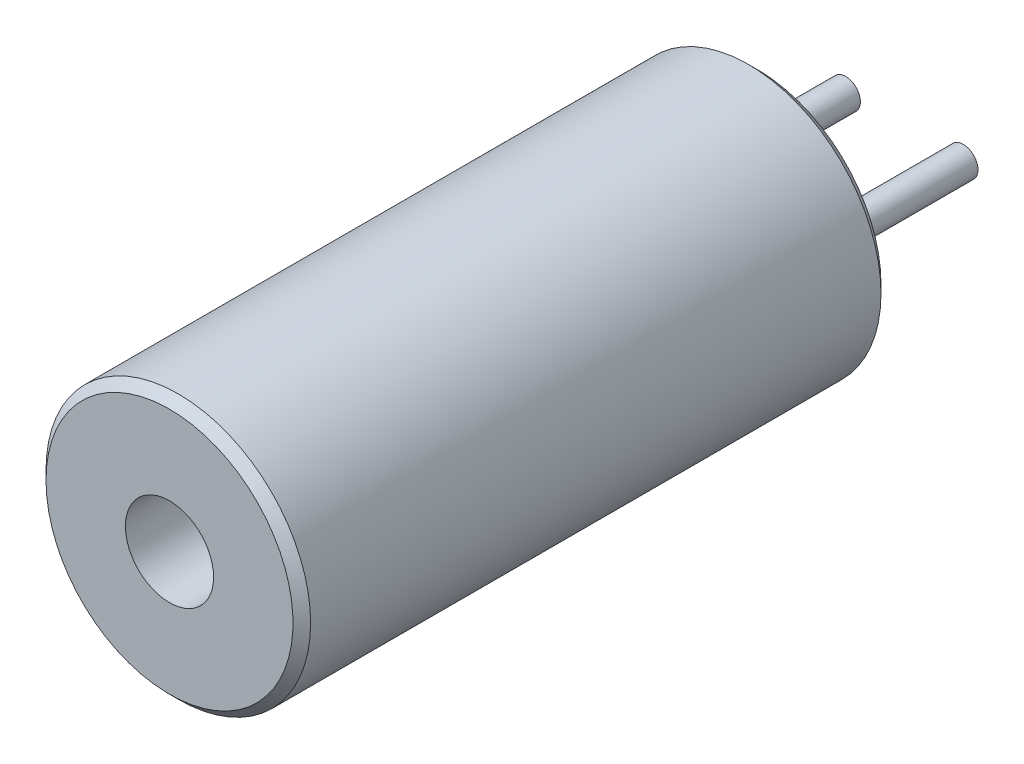
ISO-10303-21;
HEADER;
FILE_DESCRIPTION(('STEP AP214'),'2;1');
FILE_NAME('part.step','',(''),(''),'','','');
FILE_SCHEMA(('AUTOMOTIVE_DESIGN { 1 0 10303 214 1 1 1 1 }'));
ENDSEC;
DATA;
#1=APPLICATION_CONTEXT('core data for automotive mechanical design processes');
#2=APPLICATION_PROTOCOL_DEFINITION('international standard','automotive_design',2000,#1);
#3=PRODUCT_CONTEXT('',#1,'mechanical');
#4=PRODUCT('Part','Part','',(#3));
#5=PRODUCT_RELATED_PRODUCT_CATEGORY('part','',(#4));
#6=PRODUCT_DEFINITION_FORMATION('','',#4);
#7=PRODUCT_DEFINITION_CONTEXT('part definition',#1,'design');
#8=PRODUCT_DEFINITION('design','',#6,#7);
#9=PRODUCT_DEFINITION_SHAPE('','',#8);
#10=(LENGTH_UNIT() NAMED_UNIT(*) SI_UNIT(.MILLI.,.METRE.));
#11=(NAMED_UNIT(*) PLANE_ANGLE_UNIT() SI_UNIT($,.RADIAN.));
#12=(NAMED_UNIT(*) SI_UNIT($,.STERADIAN.) SOLID_ANGLE_UNIT());
#13=UNCERTAINTY_MEASURE_WITH_UNIT(LENGTH_MEASURE(1.E-05),#10,'distance_accuracy_value','');
#14=(GEOMETRIC_REPRESENTATION_CONTEXT(3) GLOBAL_UNCERTAINTY_ASSIGNED_CONTEXT((#13)) GLOBAL_UNIT_ASSIGNED_CONTEXT((#10,
#11,#12)) REPRESENTATION_CONTEXT('',''));
#15=CARTESIAN_POINT('',(0.,0.,0.));
#16=DIRECTION('',(0.,0.,1.));
#17=DIRECTION('',(1.,0.,0.));
#18=AXIS2_PLACEMENT_3D('',#15,#16,#17);
#19=CARTESIAN_POINT('',(0.,0.,10.));
#20=DIRECTION('',(0.,0.,-1.));
#21=DIRECTION('',(-1.,0.,0.));
#22=AXIS2_PLACEMENT_3D('',#19,#20,#21);
#23=PLANE('',#22);
#24=CARTESIAN_POINT('',(0.,0.,10.));
#25=DIRECTION('',(0.,0.,-1.));
#26=DIRECTION('',(-1.,0.,0.));
#27=AXIS2_PLACEMENT_3D('',#24,#25,#26);
#28=CIRCLE('',#27,4.2);
#29=CARTESIAN_POINT('',(-4.2,0.,10.));
#30=VERTEX_POINT('',#29);
#31=EDGE_CURVE('E50',#30,#30,#28,.F.);
#32=ORIENTED_EDGE('',*,*,#31,.T.);
#33=EDGE_LOOP('',(#32));
#34=FACE_BOUND('',#33,.T.);
#35=CARTESIAN_POINT('',(0.,0.,10.));
#36=DIRECTION('',(0.,0.,1.));
#37=DIRECTION('',(1.,0.,0.));
#38=AXIS2_PLACEMENT_3D('',#35,#36,#37);
#39=CIRCLE('',#38,1.5);
#40=CARTESIAN_POINT('',(1.5,0.,10.));
#41=VERTEX_POINT('',#40);
#42=EDGE_CURVE('E70',#41,#41,#39,.T.);
#43=ORIENTED_EDGE('',*,*,#42,.F.);
#44=EDGE_LOOP('',(#43));
#45=FACE_BOUND('',#44,.T.);
#46=ADVANCED_FACE('F37',(#34,#45),#23,.F.);
#47=CARTESIAN_POINT('',(0.,0.,10.));
#48=DIRECTION('',(0.,0.,1.));
#49=DIRECTION('',(1.,0.,0.));
#50=AXIS2_PLACEMENT_3D('',#47,#48,#49);
#51=CYLINDRICAL_SURFACE('',#50,4.5);
#52=CARTESIAN_POINT('',(0.,0.,-9.7));
#53=DIRECTION('',(0.,0.,1.));
#54=DIRECTION('',(1.,0.,0.));
#55=AXIS2_PLACEMENT_3D('',#52,#53,#54);
#56=CIRCLE('',#55,4.5);
#57=CARTESIAN_POINT('',(4.5,0.,-9.7));
#58=VERTEX_POINT('',#57);
#59=EDGE_CURVE('E61',#58,#58,#56,.T.);
#60=ORIENTED_EDGE('',*,*,#59,.T.);
#61=EDGE_LOOP('',(#60));
#62=FACE_BOUND('',#61,.T.);
#63=CARTESIAN_POINT('',(0.,0.,9.7));
#64=DIRECTION('',(0.,0.,-1.));
#65=DIRECTION('',(-1.,0.,0.));
#66=AXIS2_PLACEMENT_3D('',#63,#64,#65);
#67=CIRCLE('',#66,4.5);
#68=CARTESIAN_POINT('',(-4.5,0.,9.7));
#69=VERTEX_POINT('',#68);
#70=EDGE_CURVE('E65',#69,#69,#67,.T.);
#71=ORIENTED_EDGE('',*,*,#70,.T.);
#72=EDGE_LOOP('',(#71));
#73=FACE_BOUND('',#72,.T.);
#74=ADVANCED_FACE('F101',(#62,#73),#51,.T.);
#75=CARTESIAN_POINT('',(0.,4.5,-10.));
#76=DIRECTION('',(0.,0.,1.));
#77=DIRECTION('',(1.,0.,0.));
#78=AXIS2_PLACEMENT_3D('',#75,#76,#77);
#79=PLANE('',#78);
#80=CARTESIAN_POINT('',(-2.,0.,-10.));
#81=DIRECTION('',(0.,0.,1.));
#82=DIRECTION('',(1.,0.,0.));
#83=AXIS2_PLACEMENT_3D('',#80,#81,#82);
#84=CIRCLE('',#83,0.5);
#85=CARTESIAN_POINT('',(-1.5,0.,-10.));
#86=VERTEX_POINT('',#85);
#87=EDGE_CURVE('E10',#86,#86,#84,.F.);
#88=ORIENTED_EDGE('',*,*,#87,.F.);
#89=EDGE_LOOP('',(#88));
#90=FACE_BOUND('',#89,.T.);
#91=CARTESIAN_POINT('',(2.,0.,-10.));
#92=DIRECTION('',(0.,0.,1.));
#93=DIRECTION('',(1.,0.,0.));
#94=AXIS2_PLACEMENT_3D('',#91,#92,#93);
#95=CIRCLE('',#94,0.5);
#96=CARTESIAN_POINT('',(2.5,0.,-10.));
#97=VERTEX_POINT('',#96);
#98=EDGE_CURVE('E45',#97,#97,#95,.F.);
#99=ORIENTED_EDGE('',*,*,#98,.F.);
#100=EDGE_LOOP('',(#99));
#101=FACE_BOUND('',#100,.T.);
#102=CARTESIAN_POINT('',(0.,0.,-10.));
#103=DIRECTION('',(0.,0.,1.));
#104=DIRECTION('',(1.,0.,0.));
#105=AXIS2_PLACEMENT_3D('',#102,#103,#104);
#106=CIRCLE('',#105,4.2);
#107=CARTESIAN_POINT('',(4.2,0.,-10.));
#108=VERTEX_POINT('',#107);
#109=EDGE_CURVE('E55',#108,#108,#106,.F.);
#110=ORIENTED_EDGE('',*,*,#109,.T.);
#111=EDGE_LOOP('',(#110));
#112=FACE_BOUND('',#111,.T.);
#113=ADVANCED_FACE('F107',(#90,#101,#112),#79,.F.);
#114=CARTESIAN_POINT('',(0.,0.,7.));
#115=DIRECTION('',(0.,0.,1.));
#116=DIRECTION('',(1.,0.,0.));
#117=AXIS2_PLACEMENT_3D('',#114,#115,#116);
#118=CYLINDRICAL_SURFACE('',#117,1.5);
#119=CARTESIAN_POINT('',(0.,0.,7.));
#120=DIRECTION('',(0.,0.,1.));
#121=DIRECTION('',(1.,0.,0.));
#122=AXIS2_PLACEMENT_3D('',#119,#120,#121);
#123=CIRCLE('',#122,1.5);
#124=CARTESIAN_POINT('',(1.5,0.,7.));
#125=VERTEX_POINT('',#124);
#126=EDGE_CURVE('E69',#125,#125,#123,.T.);
#127=ORIENTED_EDGE('',*,*,#126,.F.);
#128=EDGE_LOOP('',(#127));
#129=FACE_BOUND('',#128,.T.);
#130=ORIENTED_EDGE('',*,*,#42,.T.);
#131=EDGE_LOOP('',(#130));
#132=FACE_BOUND('',#131,.T.);
#133=ADVANCED_FACE('F121',(#129,#132),#118,.F.);
#134=CARTESIAN_POINT('',(0.,0.,7.));
#135=DIRECTION('',(0.,0.,1.));
#136=DIRECTION('',(1.,0.,0.));
#137=AXIS2_PLACEMENT_3D('',#134,#135,#136);
#138=PLANE('',#137);
#139=ORIENTED_EDGE('',*,*,#126,.T.);
#140=EDGE_LOOP('',(#139));
#141=FACE_BOUND('',#140,.T.);
#142=ADVANCED_FACE('F114',(#141),#138,.T.);
#143=CARTESIAN_POINT('',(0.,0.,-9.7));
#144=DIRECTION('',(0.,0.,1.));
#145=DIRECTION('',(1.,0.,0.));
#146=AXIS2_PLACEMENT_3D('',#143,#144,#145);
#147=CONICAL_SURFACE('',#146,4.5,0.785398163397455);
#148=ORIENTED_EDGE('',*,*,#109,.F.);
#149=EDGE_LOOP('',(#148));
#150=FACE_BOUND('',#149,.T.);
#151=ORIENTED_EDGE('',*,*,#59,.F.);
#152=EDGE_LOOP('',(#151));
#153=FACE_BOUND('',#152,.T.);
#154=ADVANCED_FACE('F112',(#150,#153),#147,.T.);
#155=CARTESIAN_POINT('',(0.,0.,10.));
#156=DIRECTION('',(0.,0.,-1.));
#157=DIRECTION('',(-1.,0.,0.));
#158=AXIS2_PLACEMENT_3D('',#155,#156,#157);
#159=CONICAL_SURFACE('',#158,4.2,0.78539816339745);
#160=ORIENTED_EDGE('',*,*,#70,.F.);
#161=EDGE_LOOP('',(#160));
#162=FACE_BOUND('',#161,.T.);
#163=ORIENTED_EDGE('',*,*,#31,.F.);
#164=EDGE_LOOP('',(#163));
#165=FACE_BOUND('',#164,.T.);
#166=ADVANCED_FACE('F39',(#162,#165),#159,.T.);
#167=CARTESIAN_POINT('',(2.,0.,-15.));
#168=DIRECTION('',(0.,0.,1.));
#169=DIRECTION('',(1.,0.,0.));
#170=AXIS2_PLACEMENT_3D('',#167,#168,#169);
#171=CYLINDRICAL_SURFACE('',#170,0.5);
#172=CARTESIAN_POINT('',(2.,0.,-15.));
#173=DIRECTION('',(0.,0.,-1.));
#174=DIRECTION('',(-1.,0.,0.));
#175=AXIS2_PLACEMENT_3D('',#172,#173,#174);
#176=CIRCLE('',#175,0.5);
#177=CARTESIAN_POINT('',(1.5,0.,-15.));
#178=VERTEX_POINT('',#177);
#179=EDGE_CURVE('E74',#178,#178,#176,.T.);
#180=ORIENTED_EDGE('',*,*,#179,.F.);
#181=EDGE_LOOP('',(#180));
#182=FACE_BOUND('',#181,.T.);
#183=ORIENTED_EDGE('',*,*,#98,.T.);
#184=EDGE_LOOP('',(#183));
#185=FACE_BOUND('',#184,.T.);
#186=ADVANCED_FACE('F97',(#182,#185),#171,.T.);
#187=CARTESIAN_POINT('',(2.,0.,-15.));
#188=DIRECTION('',(0.,0.,-1.));
#189=DIRECTION('',(-1.,0.,0.));
#190=AXIS2_PLACEMENT_3D('',#187,#188,#189);
#191=PLANE('',#190);
#192=ORIENTED_EDGE('',*,*,#179,.T.);
#193=EDGE_LOOP('',(#192));
#194=FACE_BOUND('',#193,.T.);
#195=ADVANCED_FACE('F90',(#194),#191,.T.);
#196=CARTESIAN_POINT('',(-2.,0.,-15.));
#197=DIRECTION('',(0.,0.,1.));
#198=DIRECTION('',(1.,0.,0.));
#199=AXIS2_PLACEMENT_3D('',#196,#197,#198);
#200=CYLINDRICAL_SURFACE('',#199,0.5);
#201=CARTESIAN_POINT('',(-2.,0.,-15.));
#202=DIRECTION('',(0.,0.,-1.));
#203=DIRECTION('',(-1.,0.,0.));
#204=AXIS2_PLACEMENT_3D('',#201,#202,#203);
#205=CIRCLE('',#204,0.5);
#206=CARTESIAN_POINT('',(-2.5,0.,-15.));
#207=VERTEX_POINT('',#206);
#208=EDGE_CURVE('E81',#207,#207,#205,.T.);
#209=ORIENTED_EDGE('',*,*,#208,.F.);
#210=EDGE_LOOP('',(#209));
#211=FACE_BOUND('',#210,.T.);
#212=ORIENTED_EDGE('',*,*,#87,.T.);
#213=EDGE_LOOP('',(#212));
#214=FACE_BOUND('',#213,.T.);
#215=ADVANCED_FACE('F88',(#211,#214),#200,.T.);
#216=CARTESIAN_POINT('',(-2.,0.,-15.));
#217=DIRECTION('',(0.,0.,-1.));
#218=DIRECTION('',(-1.,0.,0.));
#219=AXIS2_PLACEMENT_3D('',#216,#217,#218);
#220=PLANE('',#219);
#221=ORIENTED_EDGE('',*,*,#208,.T.);
#222=EDGE_LOOP('',(#221));
#223=FACE_BOUND('',#222,.T.);
#224=ADVANCED_FACE('F86',(#223),#220,.T.);
#225=CLOSED_SHELL('',(#46,#74,#113,#133,#142,#154,#166,#186,#195,#215,#224));
#226=MANIFOLD_SOLID_BREP('B2',#225);
#227=ADVANCED_BREP_SHAPE_REPRESENTATION('',(#18,#226),#14);
#228=SHAPE_DEFINITION_REPRESENTATION(#9,#227);
ENDSEC;
END-ISO-10303-21;
